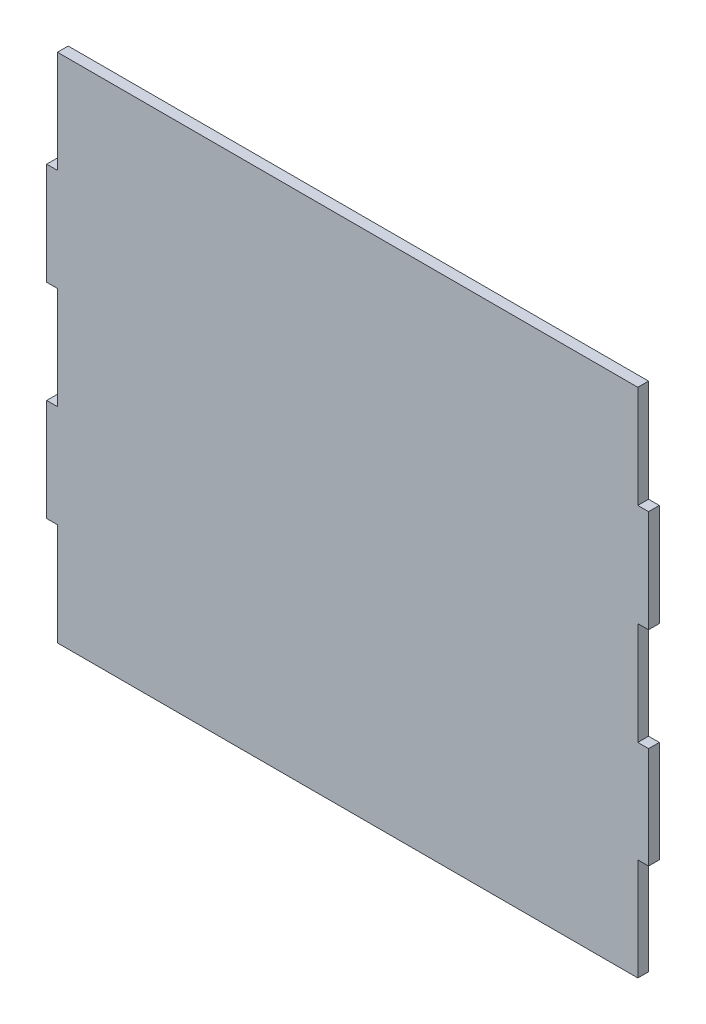
ISO-10303-21;
HEADER;
FILE_DESCRIPTION(('STEP AP214'),'2;1');
FILE_NAME('part.step','',(''),(''),'','','');
FILE_SCHEMA(('AUTOMOTIVE_DESIGN { 1 0 10303 214 1 1 1 1 }'));
ENDSEC;
DATA;
#1=APPLICATION_CONTEXT('core data for automotive mechanical design processes');
#2=APPLICATION_PROTOCOL_DEFINITION('international standard','automotive_design',2000,#1);
#3=PRODUCT_CONTEXT('',#1,'mechanical');
#4=PRODUCT('Part','Part','',(#3));
#5=PRODUCT_RELATED_PRODUCT_CATEGORY('part','',(#4));
#6=PRODUCT_DEFINITION_FORMATION('','',#4);
#7=PRODUCT_DEFINITION_CONTEXT('part definition',#1,'design');
#8=PRODUCT_DEFINITION('design','',#6,#7);
#9=PRODUCT_DEFINITION_SHAPE('','',#8);
#10=(LENGTH_UNIT() NAMED_UNIT(*) SI_UNIT(.MILLI.,.METRE.));
#11=(NAMED_UNIT(*) PLANE_ANGLE_UNIT() SI_UNIT($,.RADIAN.));
#12=(NAMED_UNIT(*) SI_UNIT($,.STERADIAN.) SOLID_ANGLE_UNIT());
#13=UNCERTAINTY_MEASURE_WITH_UNIT(LENGTH_MEASURE(1.E-05),#10,'distance_accuracy_value','');
#14=(GEOMETRIC_REPRESENTATION_CONTEXT(3) GLOBAL_UNCERTAINTY_ASSIGNED_CONTEXT((#13)) GLOBAL_UNIT_ASSIGNED_CONTEXT((#10,
#11,#12)) REPRESENTATION_CONTEXT('',''));
#15=CARTESIAN_POINT('',(0.,0.,0.));
#16=DIRECTION('',(0.,0.,1.));
#17=DIRECTION('',(1.,0.,0.));
#18=AXIS2_PLACEMENT_3D('',#15,#16,#17);
#19=CARTESIAN_POINT('',(280.,142.800000000001,5.));
#20=DIRECTION('',(0.,1.,0.));
#21=DIRECTION('',(0.,0.,1.));
#22=AXIS2_PLACEMENT_3D('',#19,#20,#21);
#23=PLANE('',#22);
#24=DIRECTION('',(1.,0.,0.));
#25=VECTOR('',#24,1.);
#26=CARTESIAN_POINT('',(280.,142.800000000001,0.));
#27=LINE('',#26,#25);
#28=CARTESIAN_POINT('',(275.,142.800000000001,0.));
#29=VERTEX_POINT('',#28);
#30=CARTESIAN_POINT('',(280.,142.800000000001,0.));
#31=VERTEX_POINT('',#30);
#32=EDGE_CURVE('E201',#29,#31,#27,.T.);
#33=ORIENTED_EDGE('',*,*,#32,.T.);
#34=DIRECTION('',(0.,0.,-1.));
#35=VECTOR('',#34,1.);
#36=CARTESIAN_POINT('',(280.,142.800000000001,5.));
#37=LINE('',#36,#35);
#38=CARTESIAN_POINT('',(280.,142.800000000001,5.));
#39=VERTEX_POINT('',#38);
#40=EDGE_CURVE('E11',#39,#31,#37,.T.);
#41=ORIENTED_EDGE('',*,*,#40,.F.);
#42=DIRECTION('',(1.,0.,0.));
#43=VECTOR('',#42,1.);
#44=CARTESIAN_POINT('',(280.,142.800000000001,5.));
#45=LINE('',#44,#43);
#46=CARTESIAN_POINT('',(275.,142.800000000001,5.));
#47=VERTEX_POINT('',#46);
#48=EDGE_CURVE('E239',#47,#39,#45,.T.);
#49=ORIENTED_EDGE('',*,*,#48,.F.);
#50=DIRECTION('',(0.,0.,-1.));
#51=VECTOR('',#50,1.);
#52=CARTESIAN_POINT('',(275.,142.800000000001,5.));
#53=LINE('',#52,#51);
#54=EDGE_CURVE('E197',#47,#29,#53,.T.);
#55=ORIENTED_EDGE('',*,*,#54,.T.);
#56=EDGE_LOOP('',(#33,#41,#49,#55));
#57=FACE_BOUND('',#56,.T.);
#58=ADVANCED_FACE('F33',(#57),#23,.F.);
#59=CARTESIAN_POINT('',(280.,142.800000000001,5.));
#60=DIRECTION('',(-1.,0.,0.));
#61=DIRECTION('',(0.,-1.,0.));
#62=AXIS2_PLACEMENT_3D('',#59,#60,#61);
#63=PLANE('',#62);
#64=DIRECTION('',(0.,1.,0.));
#65=VECTOR('',#64,1.);
#66=CARTESIAN_POINT('',(280.,142.800000000001,0.));
#67=LINE('',#66,#65);
#68=CARTESIAN_POINT('',(280.,190.400000000001,0.));
#69=VERTEX_POINT('',#68);
#70=EDGE_CURVE('E204',#31,#69,#67,.T.);
#71=ORIENTED_EDGE('',*,*,#70,.T.);
#72=DIRECTION('',(0.,0.,-1.));
#73=VECTOR('',#72,1.);
#74=CARTESIAN_POINT('',(280.,190.400000000001,5.));
#75=LINE('',#74,#73);
#76=CARTESIAN_POINT('',(280.,190.400000000001,5.));
#77=VERTEX_POINT('',#76);
#78=EDGE_CURVE('E41',#77,#69,#75,.T.);
#79=ORIENTED_EDGE('',*,*,#78,.F.);
#80=DIRECTION('',(0.,1.,0.));
#81=VECTOR('',#80,1.);
#82=CARTESIAN_POINT('',(280.,142.800000000001,5.));
#83=LINE('',#82,#81);
#84=EDGE_CURVE('E128',#39,#77,#83,.T.);
#85=ORIENTED_EDGE('',*,*,#84,.F.);
#86=ORIENTED_EDGE('',*,*,#40,.T.);
#87=EDGE_LOOP('',(#71,#79,#85,#86));
#88=FACE_BOUND('',#87,.T.);
#89=ADVANCED_FACE('F357',(#88),#63,.F.);
#90=CARTESIAN_POINT('',(280.,190.400000000001,5.));
#91=DIRECTION('',(0.,-1.,0.));
#92=DIRECTION('',(0.,0.,-1.));
#93=AXIS2_PLACEMENT_3D('',#90,#91,#92);
#94=PLANE('',#93);
#95=DIRECTION('',(-1.,0.,0.));
#96=VECTOR('',#95,1.);
#97=CARTESIAN_POINT('',(280.,190.400000000001,0.));
#98=LINE('',#97,#96);
#99=CARTESIAN_POINT('',(275.,190.400000000001,0.));
#100=VERTEX_POINT('',#99);
#101=EDGE_CURVE('E206',#69,#100,#98,.T.);
#102=ORIENTED_EDGE('',*,*,#101,.T.);
#103=DIRECTION('',(0.,0.,-1.));
#104=VECTOR('',#103,1.);
#105=CARTESIAN_POINT('',(275.,190.400000000001,5.));
#106=LINE('',#105,#104);
#107=CARTESIAN_POINT('',(275.,190.400000000001,5.));
#108=VERTEX_POINT('',#107);
#109=EDGE_CURVE('E282',#108,#100,#106,.T.);
#110=ORIENTED_EDGE('',*,*,#109,.F.);
#111=DIRECTION('',(-1.,0.,0.));
#112=VECTOR('',#111,1.);
#113=CARTESIAN_POINT('',(280.,190.400000000001,5.));
#114=LINE('',#113,#112);
#115=EDGE_CURVE('E290',#77,#108,#114,.T.);
#116=ORIENTED_EDGE('',*,*,#115,.F.);
#117=ORIENTED_EDGE('',*,*,#78,.T.);
#118=EDGE_LOOP('',(#102,#110,#116,#117));
#119=FACE_BOUND('',#118,.T.);
#120=ADVANCED_FACE('F288',(#119),#94,.F.);
#121=CARTESIAN_POINT('',(275.,238.,5.));
#122=DIRECTION('',(-1.,0.,0.));
#123=DIRECTION('',(0.,0.,1.));
#124=AXIS2_PLACEMENT_3D('',#121,#122,#123);
#125=PLANE('',#124);
#126=DIRECTION('',(0.,1.,0.));
#127=VECTOR('',#126,1.);
#128=CARTESIAN_POINT('',(275.,238.,0.));
#129=LINE('',#128,#127);
#130=CARTESIAN_POINT('',(275.,238.,0.));
#131=VERTEX_POINT('',#130);
#132=EDGE_CURVE('E208',#100,#131,#129,.T.);
#133=ORIENTED_EDGE('',*,*,#132,.T.);
#134=DIRECTION('',(0.,0.,-1.));
#135=VECTOR('',#134,1.);
#136=CARTESIAN_POINT('',(275.,238.,5.));
#137=LINE('',#136,#135);
#138=CARTESIAN_POINT('',(275.,238.,5.));
#139=VERTEX_POINT('',#138);
#140=EDGE_CURVE('E279',#139,#131,#137,.T.);
#141=ORIENTED_EDGE('',*,*,#140,.F.);
#142=DIRECTION('',(0.,1.,0.));
#143=VECTOR('',#142,1.);
#144=CARTESIAN_POINT('',(275.,238.,5.));
#145=LINE('',#144,#143);
#146=EDGE_CURVE('E308',#108,#139,#145,.T.);
#147=ORIENTED_EDGE('',*,*,#146,.F.);
#148=ORIENTED_EDGE('',*,*,#109,.T.);
#149=EDGE_LOOP('',(#133,#141,#147,#148));
#150=FACE_BOUND('',#149,.T.);
#151=ADVANCED_FACE('F299',(#150),#125,.F.);
#152=CARTESIAN_POINT('',(275.,238.,5.));
#153=DIRECTION('',(0.,-1.,0.));
#154=DIRECTION('',(0.,0.,-1.));
#155=AXIS2_PLACEMENT_3D('',#152,#153,#154);
#156=PLANE('',#155);
#157=DIRECTION('',(-1.,0.,0.));
#158=VECTOR('',#157,1.);
#159=CARTESIAN_POINT('',(275.,238.,0.));
#160=LINE('',#159,#158);
#161=CARTESIAN_POINT('',(4.99999999999998,238.,0.));
#162=VERTEX_POINT('',#161);
#163=EDGE_CURVE('E210',#131,#162,#160,.T.);
#164=ORIENTED_EDGE('',*,*,#163,.T.);
#165=DIRECTION('',(0.,0.,-1.));
#166=VECTOR('',#165,1.);
#167=CARTESIAN_POINT('',(4.99999999999998,238.,5.));
#168=LINE('',#167,#166);
#169=CARTESIAN_POINT('',(4.99999999999998,238.,5.));
#170=VERTEX_POINT('',#169);
#171=EDGE_CURVE('E276',#170,#162,#168,.T.);
#172=ORIENTED_EDGE('',*,*,#171,.F.);
#173=DIRECTION('',(-1.,0.,0.));
#174=VECTOR('',#173,1.);
#175=CARTESIAN_POINT('',(275.,238.,5.));
#176=LINE('',#175,#174);
#177=EDGE_CURVE('E305',#139,#170,#176,.T.);
#178=ORIENTED_EDGE('',*,*,#177,.F.);
#179=ORIENTED_EDGE('',*,*,#140,.T.);
#180=EDGE_LOOP('',(#164,#172,#178,#179));
#181=FACE_BOUND('',#180,.T.);
#182=ADVANCED_FACE('F303',(#181),#156,.F.);
#183=CARTESIAN_POINT('',(4.99999999999998,238.,5.));
#184=DIRECTION('',(1.,0.,0.));
#185=DIRECTION('',(0.,1.,0.));
#186=AXIS2_PLACEMENT_3D('',#183,#184,#185);
#187=PLANE('',#186);
#188=DIRECTION('',(0.,-1.,0.));
#189=VECTOR('',#188,1.);
#190=CARTESIAN_POINT('',(4.99999999999998,238.,0.));
#191=LINE('',#190,#189);
#192=CARTESIAN_POINT('',(4.99999999999998,190.4,0.));
#193=VERTEX_POINT('',#192);
#194=EDGE_CURVE('E212',#162,#193,#191,.T.);
#195=ORIENTED_EDGE('',*,*,#194,.T.);
#196=DIRECTION('',(0.,0.,-1.));
#197=VECTOR('',#196,1.);
#198=CARTESIAN_POINT('',(4.99999999999998,190.4,5.));
#199=LINE('',#198,#197);
#200=CARTESIAN_POINT('',(4.99999999999998,190.4,5.));
#201=VERTEX_POINT('',#200);
#202=EDGE_CURVE('E273',#201,#193,#199,.T.);
#203=ORIENTED_EDGE('',*,*,#202,.F.);
#204=DIRECTION('',(0.,-1.,0.));
#205=VECTOR('',#204,1.);
#206=CARTESIAN_POINT('',(4.99999999999998,238.,5.));
#207=LINE('',#206,#205);
#208=EDGE_CURVE('E307',#170,#201,#207,.T.);
#209=ORIENTED_EDGE('',*,*,#208,.F.);
#210=ORIENTED_EDGE('',*,*,#171,.T.);
#211=EDGE_LOOP('',(#195,#203,#209,#210));
#212=FACE_BOUND('',#211,.T.);
#213=ADVANCED_FACE('F370',(#212),#187,.F.);
#214=CARTESIAN_POINT('',(0.,190.4,5.));
#215=DIRECTION('',(0.,-1.,0.));
#216=DIRECTION('',(1.,0.,0.));
#217=AXIS2_PLACEMENT_3D('',#214,#215,#216);
#218=PLANE('',#217);
#219=DIRECTION('',(-1.,0.,0.));
#220=VECTOR('',#219,1.);
#221=CARTESIAN_POINT('',(0.,190.4,0.));
#222=LINE('',#221,#220);
#223=CARTESIAN_POINT('',(0.,190.4,0.));
#224=VERTEX_POINT('',#223);
#225=EDGE_CURVE('E214',#193,#224,#222,.T.);
#226=ORIENTED_EDGE('',*,*,#225,.T.);
#227=DIRECTION('',(0.,0.,-1.));
#228=VECTOR('',#227,1.);
#229=CARTESIAN_POINT('',(0.,190.4,5.));
#230=LINE('',#229,#228);
#231=CARTESIAN_POINT('',(0.,190.4,5.));
#232=VERTEX_POINT('',#231);
#233=EDGE_CURVE('E270',#232,#224,#230,.T.);
#234=ORIENTED_EDGE('',*,*,#233,.F.);
#235=DIRECTION('',(-1.,0.,0.));
#236=VECTOR('',#235,1.);
#237=CARTESIAN_POINT('',(0.,190.4,5.));
#238=LINE('',#237,#236);
#239=EDGE_CURVE('E310',#201,#232,#238,.T.);
#240=ORIENTED_EDGE('',*,*,#239,.F.);
#241=ORIENTED_EDGE('',*,*,#202,.T.);
#242=EDGE_LOOP('',(#226,#234,#240,#241));
#243=FACE_BOUND('',#242,.T.);
#244=ADVANCED_FACE('F373',(#243),#218,.F.);
#245=CARTESIAN_POINT('',(0.,190.4,5.));
#246=DIRECTION('',(1.,0.,0.));
#247=DIRECTION('',(0.,1.,0.));
#248=AXIS2_PLACEMENT_3D('',#245,#246,#247);
#249=PLANE('',#248);
#250=DIRECTION('',(0.,-1.,0.));
#251=VECTOR('',#250,1.);
#252=CARTESIAN_POINT('',(0.,190.4,0.));
#253=LINE('',#252,#251);
#254=CARTESIAN_POINT('',(0.,142.8,0.));
#255=VERTEX_POINT('',#254);
#256=EDGE_CURVE('E216',#224,#255,#253,.T.);
#257=ORIENTED_EDGE('',*,*,#256,.T.);
#258=DIRECTION('',(0.,0.,-1.));
#259=VECTOR('',#258,1.);
#260=CARTESIAN_POINT('',(0.,142.8,5.));
#261=LINE('',#260,#259);
#262=CARTESIAN_POINT('',(0.,142.8,5.));
#263=VERTEX_POINT('',#262);
#264=EDGE_CURVE('E267',#263,#255,#261,.T.);
#265=ORIENTED_EDGE('',*,*,#264,.F.);
#266=DIRECTION('',(0.,-1.,0.));
#267=VECTOR('',#266,1.);
#268=CARTESIAN_POINT('',(0.,190.4,5.));
#269=LINE('',#268,#267);
#270=EDGE_CURVE('E316',#232,#263,#269,.T.);
#271=ORIENTED_EDGE('',*,*,#270,.F.);
#272=ORIENTED_EDGE('',*,*,#233,.T.);
#273=EDGE_LOOP('',(#257,#265,#271,#272));
#274=FACE_BOUND('',#273,.T.);
#275=ADVANCED_FACE('F377',(#274),#249,.F.);
#276=CARTESIAN_POINT('',(0.,142.8,5.));
#277=DIRECTION('',(-1.11022302462517E-13,1.,0.));
#278=DIRECTION('',(-1.,-1.11022302462517E-13,0.));
#279=AXIS2_PLACEMENT_3D('',#276,#277,#278);
#280=PLANE('',#279);
#281=DIRECTION('',(1.,1.11022302462517E-13,0.));
#282=VECTOR('',#281,1.);
#283=CARTESIAN_POINT('',(0.,142.8,0.));
#284=LINE('',#283,#282);
#285=CARTESIAN_POINT('',(4.99999999999999,142.800000000001,0.));
#286=VERTEX_POINT('',#285);
#287=EDGE_CURVE('E218',#255,#286,#284,.T.);
#288=ORIENTED_EDGE('',*,*,#287,.T.);
#289=DIRECTION('',(0.,0.,-1.));
#290=VECTOR('',#289,1.);
#291=CARTESIAN_POINT('',(4.99999999999999,142.800000000001,5.));
#292=LINE('',#291,#290);
#293=CARTESIAN_POINT('',(4.99999999999999,142.800000000001,5.));
#294=VERTEX_POINT('',#293);
#295=EDGE_CURVE('E264',#294,#286,#292,.T.);
#296=ORIENTED_EDGE('',*,*,#295,.F.);
#297=DIRECTION('',(1.,1.11022302462517E-13,0.));
#298=VECTOR('',#297,1.);
#299=CARTESIAN_POINT('',(0.,142.8,5.));
#300=LINE('',#299,#298);
#301=EDGE_CURVE('E318',#263,#294,#300,.T.);
#302=ORIENTED_EDGE('',*,*,#301,.F.);
#303=ORIENTED_EDGE('',*,*,#264,.T.);
#304=EDGE_LOOP('',(#288,#296,#302,#303));
#305=FACE_BOUND('',#304,.T.);
#306=ADVANCED_FACE('F381',(#305),#280,.F.);
#307=CARTESIAN_POINT('',(4.99999999999999,142.800000000001,5.));
#308=DIRECTION('',(1.,0.,0.));
#309=DIRECTION('',(0.,1.,0.));
#310=AXIS2_PLACEMENT_3D('',#307,#308,#309);
#311=PLANE('',#310);
#312=DIRECTION('',(0.,-1.,0.));
#313=VECTOR('',#312,1.);
#314=CARTESIAN_POINT('',(4.99999999999999,142.800000000001,0.));
#315=LINE('',#314,#313);
#316=CARTESIAN_POINT('',(5.00000000000021,95.2,0.));
#317=VERTEX_POINT('',#316);
#318=EDGE_CURVE('E220',#286,#317,#315,.T.);
#319=ORIENTED_EDGE('',*,*,#318,.T.);
#320=DIRECTION('',(0.,0.,-1.));
#321=VECTOR('',#320,1.);
#322=CARTESIAN_POINT('',(5.00000000000021,95.2,5.));
#323=LINE('',#322,#321);
#324=CARTESIAN_POINT('',(5.00000000000021,95.2,5.));
#325=VERTEX_POINT('',#324);
#326=EDGE_CURVE('E261',#325,#317,#323,.T.);
#327=ORIENTED_EDGE('',*,*,#326,.F.);
#328=DIRECTION('',(0.,-1.,0.));
#329=VECTOR('',#328,1.);
#330=CARTESIAN_POINT('',(4.99999999999999,142.800000000001,5.));
#331=LINE('',#330,#329);
#332=EDGE_CURVE('E320',#294,#325,#331,.T.);
#333=ORIENTED_EDGE('',*,*,#332,.F.);
#334=ORIENTED_EDGE('',*,*,#295,.T.);
#335=EDGE_LOOP('',(#319,#327,#333,#334));
#336=FACE_BOUND('',#335,.T.);
#337=ADVANCED_FACE('F385',(#336),#311,.F.);
#338=CARTESIAN_POINT('',(0.,95.2,5.));
#339=DIRECTION('',(0.,-1.,0.));
#340=DIRECTION('',(1.,0.,0.));
#341=AXIS2_PLACEMENT_3D('',#338,#339,#340);
#342=PLANE('',#341);
#343=DIRECTION('',(-1.,0.,0.));
#344=VECTOR('',#343,1.);
#345=CARTESIAN_POINT('',(0.,95.2,0.));
#346=LINE('',#345,#344);
#347=CARTESIAN_POINT('',(0.,95.2,0.));
#348=VERTEX_POINT('',#347);
#349=EDGE_CURVE('E222',#317,#348,#346,.T.);
#350=ORIENTED_EDGE('',*,*,#349,.T.);
#351=DIRECTION('',(0.,0.,-1.));
#352=VECTOR('',#351,1.);
#353=CARTESIAN_POINT('',(0.,95.2,5.));
#354=LINE('',#353,#352);
#355=CARTESIAN_POINT('',(0.,95.2,5.));
#356=VERTEX_POINT('',#355);
#357=EDGE_CURVE('E258',#356,#348,#354,.T.);
#358=ORIENTED_EDGE('',*,*,#357,.F.);
#359=DIRECTION('',(-1.,0.,0.));
#360=VECTOR('',#359,1.);
#361=CARTESIAN_POINT('',(0.,95.2,5.));
#362=LINE('',#361,#360);
#363=EDGE_CURVE('E322',#325,#356,#362,.T.);
#364=ORIENTED_EDGE('',*,*,#363,.F.);
#365=ORIENTED_EDGE('',*,*,#326,.T.);
#366=EDGE_LOOP('',(#350,#358,#364,#365));
#367=FACE_BOUND('',#366,.T.);
#368=ADVANCED_FACE('F389',(#367),#342,.F.);
#369=CARTESIAN_POINT('',(0.,95.2,5.));
#370=DIRECTION('',(1.,0.,0.));
#371=DIRECTION('',(0.,1.,0.));
#372=AXIS2_PLACEMENT_3D('',#369,#370,#371);
#373=PLANE('',#372);
#374=DIRECTION('',(0.,-1.,0.));
#375=VECTOR('',#374,1.);
#376=CARTESIAN_POINT('',(0.,95.2,0.));
#377=LINE('',#376,#375);
#378=CARTESIAN_POINT('',(0.,47.6,0.));
#379=VERTEX_POINT('',#378);
#380=EDGE_CURVE('E224',#348,#379,#377,.T.);
#381=ORIENTED_EDGE('',*,*,#380,.T.);
#382=DIRECTION('',(0.,0.,-1.));
#383=VECTOR('',#382,1.);
#384=CARTESIAN_POINT('',(0.,47.6,5.));
#385=LINE('',#384,#383);
#386=CARTESIAN_POINT('',(0.,47.6,5.));
#387=VERTEX_POINT('',#386);
#388=EDGE_CURVE('E255',#387,#379,#385,.T.);
#389=ORIENTED_EDGE('',*,*,#388,.F.);
#390=DIRECTION('',(0.,-1.,0.));
#391=VECTOR('',#390,1.);
#392=CARTESIAN_POINT('',(0.,95.2,5.));
#393=LINE('',#392,#391);
#394=EDGE_CURVE('E324',#356,#387,#393,.T.);
#395=ORIENTED_EDGE('',*,*,#394,.F.);
#396=ORIENTED_EDGE('',*,*,#357,.T.);
#397=EDGE_LOOP('',(#381,#389,#395,#396));
#398=FACE_BOUND('',#397,.T.);
#399=ADVANCED_FACE('F393',(#398),#373,.F.);
#400=CARTESIAN_POINT('',(0.,47.6,5.));
#401=DIRECTION('',(0.,1.,0.));
#402=DIRECTION('',(0.,0.,1.));
#403=AXIS2_PLACEMENT_3D('',#400,#401,#402);
#404=PLANE('',#403);
#405=DIRECTION('',(1.,0.,0.));
#406=VECTOR('',#405,1.);
#407=CARTESIAN_POINT('',(0.,47.6,0.));
#408=LINE('',#407,#406);
#409=CARTESIAN_POINT('',(5.,47.6,0.));
#410=VERTEX_POINT('',#409);
#411=EDGE_CURVE('E226',#379,#410,#408,.T.);
#412=ORIENTED_EDGE('',*,*,#411,.T.);
#413=DIRECTION('',(0.,0.,-1.));
#414=VECTOR('',#413,1.);
#415=CARTESIAN_POINT('',(5.,47.6,5.));
#416=LINE('',#415,#414);
#417=CARTESIAN_POINT('',(5.,47.6,5.));
#418=VERTEX_POINT('',#417);
#419=EDGE_CURVE('E252',#418,#410,#416,.T.);
#420=ORIENTED_EDGE('',*,*,#419,.F.);
#421=DIRECTION('',(1.,0.,0.));
#422=VECTOR('',#421,1.);
#423=CARTESIAN_POINT('',(0.,47.6,5.));
#424=LINE('',#423,#422);
#425=EDGE_CURVE('E326',#387,#418,#424,.T.);
#426=ORIENTED_EDGE('',*,*,#425,.F.);
#427=ORIENTED_EDGE('',*,*,#388,.T.);
#428=EDGE_LOOP('',(#412,#420,#426,#427));
#429=FACE_BOUND('',#428,.T.);
#430=ADVANCED_FACE('F397',(#429),#404,.F.);
#431=CARTESIAN_POINT('',(5.,47.6,5.));
#432=DIRECTION('',(1.,0.,0.));
#433=DIRECTION('',(0.,1.,0.));
#434=AXIS2_PLACEMENT_3D('',#431,#432,#433);
#435=PLANE('',#434);
#436=DIRECTION('',(0.,-1.,0.));
#437=VECTOR('',#436,1.);
#438=CARTESIAN_POINT('',(5.,47.6,0.));
#439=LINE('',#438,#437);
#440=CARTESIAN_POINT('',(5.00000000000043,0.,0.));
#441=VERTEX_POINT('',#440);
#442=EDGE_CURVE('E228',#410,#441,#439,.T.);
#443=ORIENTED_EDGE('',*,*,#442,.T.);
#444=DIRECTION('',(0.,0.,-1.));
#445=VECTOR('',#444,1.);
#446=CARTESIAN_POINT('',(5.00000000000043,0.,5.));
#447=LINE('',#446,#445);
#448=CARTESIAN_POINT('',(5.00000000000043,0.,5.));
#449=VERTEX_POINT('',#448);
#450=EDGE_CURVE('E249',#449,#441,#447,.T.);
#451=ORIENTED_EDGE('',*,*,#450,.F.);
#452=DIRECTION('',(0.,-1.,0.));
#453=VECTOR('',#452,1.);
#454=CARTESIAN_POINT('',(5.,47.6,5.));
#455=LINE('',#454,#453);
#456=EDGE_CURVE('E328',#418,#449,#455,.T.);
#457=ORIENTED_EDGE('',*,*,#456,.F.);
#458=ORIENTED_EDGE('',*,*,#419,.T.);
#459=EDGE_LOOP('',(#443,#451,#457,#458));
#460=FACE_BOUND('',#459,.T.);
#461=ADVANCED_FACE('F401',(#460),#435,.F.);
#462=CARTESIAN_POINT('',(5.00000000000043,0.,5.));
#463=DIRECTION('',(0.,1.,0.));
#464=DIRECTION('',(-1.,0.,0.));
#465=AXIS2_PLACEMENT_3D('',#462,#463,#464);
#466=PLANE('',#465);
#467=DIRECTION('',(1.,0.,0.));
#468=VECTOR('',#467,1.);
#469=CARTESIAN_POINT('',(5.00000000000043,0.,0.));
#470=LINE('',#469,#468);
#471=CARTESIAN_POINT('',(275.,6.10622663543836E-13,0.));
#472=VERTEX_POINT('',#471);
#473=EDGE_CURVE('E230',#441,#472,#470,.T.);
#474=ORIENTED_EDGE('',*,*,#473,.T.);
#475=DIRECTION('',(0.,0.,-1.));
#476=VECTOR('',#475,1.);
#477=CARTESIAN_POINT('',(275.,6.10622663543836E-13,5.));
#478=LINE('',#477,#476);
#479=CARTESIAN_POINT('',(275.,6.10622663543836E-13,5.));
#480=VERTEX_POINT('',#479);
#481=EDGE_CURVE('E246',#480,#472,#478,.T.);
#482=ORIENTED_EDGE('',*,*,#481,.F.);
#483=DIRECTION('',(1.,0.,0.));
#484=VECTOR('',#483,1.);
#485=CARTESIAN_POINT('',(5.00000000000043,0.,5.));
#486=LINE('',#485,#484);
#487=EDGE_CURVE('E330',#449,#480,#486,.T.);
#488=ORIENTED_EDGE('',*,*,#487,.F.);
#489=ORIENTED_EDGE('',*,*,#450,.T.);
#490=EDGE_LOOP('',(#474,#482,#488,#489));
#491=FACE_BOUND('',#490,.T.);
#492=ADVANCED_FACE('F405',(#491),#466,.F.);
#493=CARTESIAN_POINT('',(275.,47.6000000000001,5.));
#494=DIRECTION('',(-1.,0.,0.));
#495=DIRECTION('',(0.,-1.,0.));
#496=AXIS2_PLACEMENT_3D('',#493,#494,#495);
#497=PLANE('',#496);
#498=DIRECTION('',(0.,1.,0.));
#499=VECTOR('',#498,1.);
#500=CARTESIAN_POINT('',(275.,47.6000000000001,0.));
#501=LINE('',#500,#499);
#502=CARTESIAN_POINT('',(275.,47.6000000000001,0.));
#503=VERTEX_POINT('',#502);
#504=EDGE_CURVE('E232',#472,#503,#501,.T.);
#505=ORIENTED_EDGE('',*,*,#504,.T.);
#506=DIRECTION('',(0.,0.,-1.));
#507=VECTOR('',#506,1.);
#508=CARTESIAN_POINT('',(275.,47.6000000000001,5.));
#509=LINE('',#508,#507);
#510=CARTESIAN_POINT('',(275.,47.6000000000001,5.));
#511=VERTEX_POINT('',#510);
#512=EDGE_CURVE('E243',#511,#503,#509,.T.);
#513=ORIENTED_EDGE('',*,*,#512,.F.);
#514=DIRECTION('',(0.,1.,0.));
#515=VECTOR('',#514,1.);
#516=CARTESIAN_POINT('',(275.,47.6000000000001,5.));
#517=LINE('',#516,#515);
#518=EDGE_CURVE('E332',#480,#511,#517,.T.);
#519=ORIENTED_EDGE('',*,*,#518,.F.);
#520=ORIENTED_EDGE('',*,*,#481,.T.);
#521=EDGE_LOOP('',(#505,#513,#519,#520));
#522=FACE_BOUND('',#521,.T.);
#523=ADVANCED_FACE('F338',(#522),#497,.F.);
#524=CARTESIAN_POINT('',(280.,47.6000000000001,5.));
#525=DIRECTION('',(0.,1.,0.));
#526=DIRECTION('',(0.,0.,1.));
#527=AXIS2_PLACEMENT_3D('',#524,#525,#526);
#528=PLANE('',#527);
#529=DIRECTION('',(1.,0.,0.));
#530=VECTOR('',#529,1.);
#531=CARTESIAN_POINT('',(280.,47.6000000000001,0.));
#532=LINE('',#531,#530);
#533=CARTESIAN_POINT('',(280.,47.6000000000001,0.));
#534=VERTEX_POINT('',#533);
#535=EDGE_CURVE('E234',#503,#534,#532,.T.);
#536=ORIENTED_EDGE('',*,*,#535,.T.);
#537=DIRECTION('',(0.,0.,-1.));
#538=VECTOR('',#537,1.);
#539=CARTESIAN_POINT('',(280.,47.6000000000001,5.));
#540=LINE('',#539,#538);
#541=CARTESIAN_POINT('',(280.,47.6000000000001,5.));
#542=VERTEX_POINT('',#541);
#543=EDGE_CURVE('E192',#542,#534,#540,.T.);
#544=ORIENTED_EDGE('',*,*,#543,.F.);
#545=DIRECTION('',(1.,0.,0.));
#546=VECTOR('',#545,1.);
#547=CARTESIAN_POINT('',(280.,47.6000000000001,5.));
#548=LINE('',#547,#546);
#549=EDGE_CURVE('E183',#511,#542,#548,.T.);
#550=ORIENTED_EDGE('',*,*,#549,.F.);
#551=ORIENTED_EDGE('',*,*,#512,.T.);
#552=EDGE_LOOP('',(#536,#544,#550,#551));
#553=FACE_BOUND('',#552,.T.);
#554=ADVANCED_FACE('F342',(#553),#528,.F.);
#555=CARTESIAN_POINT('',(280.,47.6000000000001,5.));
#556=DIRECTION('',(-1.,0.,0.));
#557=DIRECTION('',(0.,-1.,0.));
#558=AXIS2_PLACEMENT_3D('',#555,#556,#557);
#559=PLANE('',#558);
#560=DIRECTION('',(0.,1.,0.));
#561=VECTOR('',#560,1.);
#562=CARTESIAN_POINT('',(280.,47.6000000000001,0.));
#563=LINE('',#562,#561);
#564=CARTESIAN_POINT('',(280.,94.918350866846,0.));
#565=VERTEX_POINT('',#564);
#566=EDGE_CURVE('E191',#534,#565,#563,.T.);
#567=ORIENTED_EDGE('',*,*,#566,.T.);
#568=DIRECTION('',(0.,0.,-1.));
#569=VECTOR('',#568,1.);
#570=CARTESIAN_POINT('',(280.,94.918350866846,5.));
#571=LINE('',#570,#569);
#572=CARTESIAN_POINT('',(280.,94.918350866846,5.));
#573=VERTEX_POINT('',#572);
#574=EDGE_CURVE('E188',#573,#565,#571,.T.);
#575=ORIENTED_EDGE('',*,*,#574,.F.);
#576=DIRECTION('',(0.,1.,0.));
#577=VECTOR('',#576,1.);
#578=CARTESIAN_POINT('',(280.,47.6000000000001,5.));
#579=LINE('',#578,#577);
#580=EDGE_CURVE('E177',#542,#573,#579,.T.);
#581=ORIENTED_EDGE('',*,*,#580,.F.);
#582=ORIENTED_EDGE('',*,*,#543,.T.);
#583=EDGE_LOOP('',(#567,#575,#581,#582));
#584=FACE_BOUND('',#583,.T.);
#585=ADVANCED_FACE('F189',(#584),#559,.F.);
#586=CARTESIAN_POINT('',(280.,94.918350866846,5.));
#587=DIRECTION('',(0.,-1.,0.));
#588=DIRECTION('',(0.,0.,-1.));
#589=AXIS2_PLACEMENT_3D('',#586,#587,#588);
#590=PLANE('',#589);
#591=DIRECTION('',(-1.,0.,0.));
#592=VECTOR('',#591,1.);
#593=CARTESIAN_POINT('',(280.,94.918350866846,0.));
#594=LINE('',#593,#592);
#595=CARTESIAN_POINT('',(275.000000000001,94.918350866846,0.));
#596=VERTEX_POINT('',#595);
#597=EDGE_CURVE('E114',#565,#596,#594,.T.);
#598=ORIENTED_EDGE('',*,*,#597,.T.);
#599=DIRECTION('',(0.,0.,-1.));
#600=VECTOR('',#599,1.);
#601=CARTESIAN_POINT('',(275.000000000001,94.918350866846,5.));
#602=LINE('',#601,#600);
#603=CARTESIAN_POINT('',(275.000000000001,94.918350866846,5.));
#604=VERTEX_POINT('',#603);
#605=EDGE_CURVE('E193',#604,#596,#602,.T.);
#606=ORIENTED_EDGE('',*,*,#605,.F.);
#607=DIRECTION('',(-1.,0.,0.));
#608=VECTOR('',#607,1.);
#609=CARTESIAN_POINT('',(280.,94.918350866846,5.));
#610=LINE('',#609,#608);
#611=EDGE_CURVE('E181',#573,#604,#610,.T.);
#612=ORIENTED_EDGE('',*,*,#611,.F.);
#613=ORIENTED_EDGE('',*,*,#574,.T.);
#614=EDGE_LOOP('',(#598,#606,#612,#613));
#615=FACE_BOUND('',#614,.T.);
#616=ADVANCED_FACE('F195',(#615),#590,.F.);
#617=CARTESIAN_POINT('',(275.,142.800000000001,5.));
#618=DIRECTION('',(-1.,0.,0.));
#619=DIRECTION('',(0.,-1.,0.));
#620=AXIS2_PLACEMENT_3D('',#617,#618,#619);
#621=PLANE('',#620);
#622=DIRECTION('',(0.,1.,0.));
#623=VECTOR('',#622,1.);
#624=CARTESIAN_POINT('',(275.,142.800000000001,0.));
#625=LINE('',#624,#623);
#626=EDGE_CURVE('E120',#596,#29,#625,.T.);
#627=ORIENTED_EDGE('',*,*,#626,.T.);
#628=ORIENTED_EDGE('',*,*,#54,.F.);
#629=DIRECTION('',(0.,1.,0.));
#630=VECTOR('',#629,1.);
#631=CARTESIAN_POINT('',(275.,142.800000000001,5.));
#632=LINE('',#631,#630);
#633=EDGE_CURVE('E49',#604,#47,#632,.T.);
#634=ORIENTED_EDGE('',*,*,#633,.F.);
#635=ORIENTED_EDGE('',*,*,#605,.T.);
#636=EDGE_LOOP('',(#627,#628,#634,#635));
#637=FACE_BOUND('',#636,.T.);
#638=ADVANCED_FACE('F346',(#637),#621,.F.);
#639=CARTESIAN_POINT('',(0.,0.,5.));
#640=DIRECTION('',(0.,0.,1.));
#641=DIRECTION('',(1.,0.,0.));
#642=AXIS2_PLACEMENT_3D('',#639,#640,#641);
#643=PLANE('',#642);
#644=ORIENTED_EDGE('',*,*,#48,.T.);
#645=ORIENTED_EDGE('',*,*,#84,.T.);
#646=ORIENTED_EDGE('',*,*,#115,.T.);
#647=ORIENTED_EDGE('',*,*,#146,.T.);
#648=ORIENTED_EDGE('',*,*,#177,.T.);
#649=ORIENTED_EDGE('',*,*,#208,.T.);
#650=ORIENTED_EDGE('',*,*,#239,.T.);
#651=ORIENTED_EDGE('',*,*,#270,.T.);
#652=ORIENTED_EDGE('',*,*,#301,.T.);
#653=ORIENTED_EDGE('',*,*,#332,.T.);
#654=ORIENTED_EDGE('',*,*,#363,.T.);
#655=ORIENTED_EDGE('',*,*,#394,.T.);
#656=ORIENTED_EDGE('',*,*,#425,.T.);
#657=ORIENTED_EDGE('',*,*,#456,.T.);
#658=ORIENTED_EDGE('',*,*,#487,.T.);
#659=ORIENTED_EDGE('',*,*,#518,.T.);
#660=ORIENTED_EDGE('',*,*,#549,.T.);
#661=ORIENTED_EDGE('',*,*,#580,.T.);
#662=ORIENTED_EDGE('',*,*,#611,.T.);
#663=ORIENTED_EDGE('',*,*,#633,.T.);
#664=EDGE_LOOP('',(#644,#645,#646,#647,#648,#649,#650,#651,#652,#653,#654,#655,#656,#657,#658,
#659,#660,#661,#662,#663));
#665=FACE_BOUND('',#664,.T.);
#666=ADVANCED_FACE('F179',(#665),#643,.T.);
#667=CARTESIAN_POINT('',(0.,0.,0.));
#668=DIRECTION('',(0.,0.,1.));
#669=DIRECTION('',(1.,0.,0.));
#670=AXIS2_PLACEMENT_3D('',#667,#668,#669);
#671=PLANE('',#670);
#672=ORIENTED_EDGE('',*,*,#32,.F.);
#673=ORIENTED_EDGE('',*,*,#626,.F.);
#674=ORIENTED_EDGE('',*,*,#597,.F.);
#675=ORIENTED_EDGE('',*,*,#566,.F.);
#676=ORIENTED_EDGE('',*,*,#535,.F.);
#677=ORIENTED_EDGE('',*,*,#504,.F.);
#678=ORIENTED_EDGE('',*,*,#473,.F.);
#679=ORIENTED_EDGE('',*,*,#442,.F.);
#680=ORIENTED_EDGE('',*,*,#411,.F.);
#681=ORIENTED_EDGE('',*,*,#380,.F.);
#682=ORIENTED_EDGE('',*,*,#349,.F.);
#683=ORIENTED_EDGE('',*,*,#318,.F.);
#684=ORIENTED_EDGE('',*,*,#287,.F.);
#685=ORIENTED_EDGE('',*,*,#256,.F.);
#686=ORIENTED_EDGE('',*,*,#225,.F.);
#687=ORIENTED_EDGE('',*,*,#194,.F.);
#688=ORIENTED_EDGE('',*,*,#163,.F.);
#689=ORIENTED_EDGE('',*,*,#132,.F.);
#690=ORIENTED_EDGE('',*,*,#101,.F.);
#691=ORIENTED_EDGE('',*,*,#70,.F.);
#692=EDGE_LOOP('',(#672,#673,#674,#675,#676,#677,#678,#679,#680,#681,#682,#683,#684,#685,#686,
#687,#688,#689,#690,#691));
#693=FACE_BOUND('',#692,.T.);
#694=ADVANCED_FACE('F294',(#693),#671,.F.);
#695=CLOSED_SHELL('',(#58,#89,#120,#151,#182,#213,#244,#275,#306,#337,#368,#399,#430,#461,#492,
#523,#554,#585,#616,#638,#666,#694));
#696=MANIFOLD_SOLID_BREP('B2',#695);
#697=ADVANCED_BREP_SHAPE_REPRESENTATION('',(#18,#696),#14);
#698=SHAPE_DEFINITION_REPRESENTATION(#9,#697);
ENDSEC;
END-ISO-10303-21;
